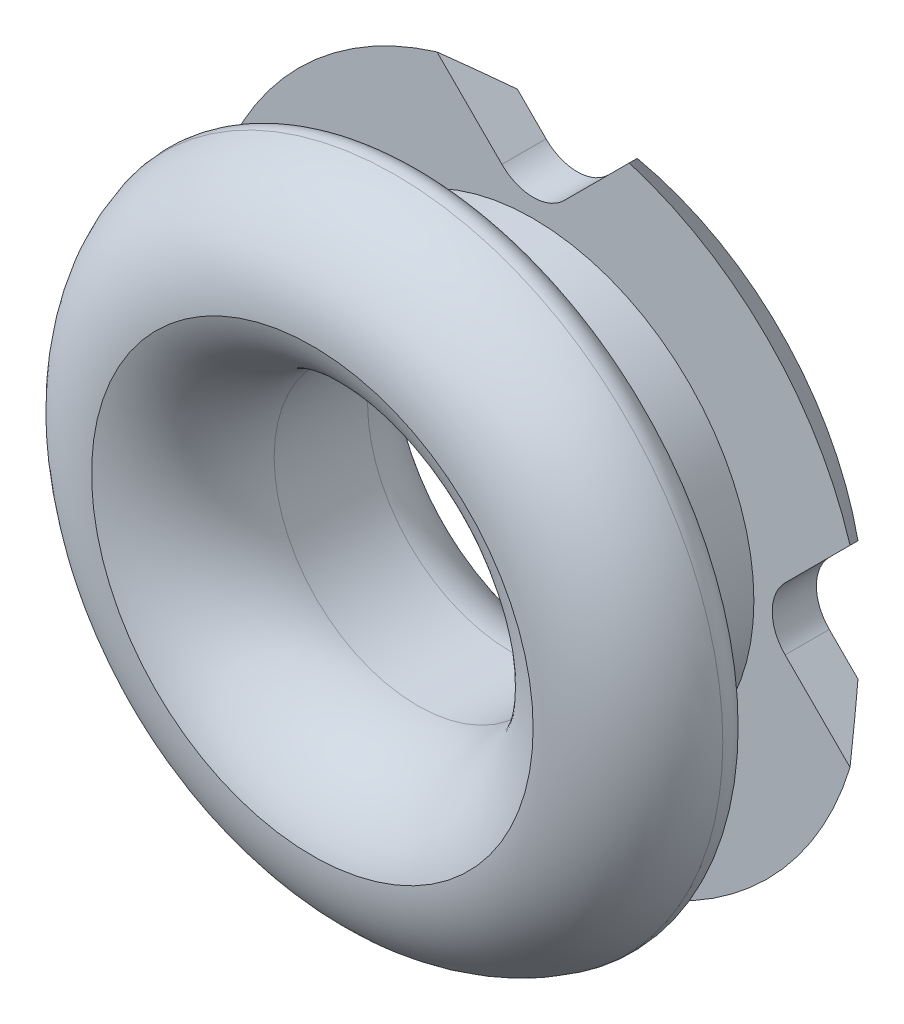
ISO-10303-21;
HEADER;
FILE_DESCRIPTION(('STEP AP214'),'2;1');
FILE_NAME('part.step','',(''),(''),'','','');
FILE_SCHEMA(('AUTOMOTIVE_DESIGN { 1 0 10303 214 1 1 1 1 }'));
ENDSEC;
DATA;
#1=APPLICATION_CONTEXT('core data for automotive mechanical design processes');
#2=APPLICATION_PROTOCOL_DEFINITION('international standard','automotive_design',2000,#1);
#3=PRODUCT_CONTEXT('',#1,'mechanical');
#4=PRODUCT('Part','Part','',(#3));
#5=PRODUCT_RELATED_PRODUCT_CATEGORY('part','',(#4));
#6=PRODUCT_DEFINITION_FORMATION('','',#4);
#7=PRODUCT_DEFINITION_CONTEXT('part definition',#1,'design');
#8=PRODUCT_DEFINITION('design','',#6,#7);
#9=PRODUCT_DEFINITION_SHAPE('','',#8);
#10=(LENGTH_UNIT() NAMED_UNIT(*) SI_UNIT(.MILLI.,.METRE.));
#11=(NAMED_UNIT(*) PLANE_ANGLE_UNIT() SI_UNIT($,.RADIAN.));
#12=(NAMED_UNIT(*) SI_UNIT($,.STERADIAN.) SOLID_ANGLE_UNIT());
#13=UNCERTAINTY_MEASURE_WITH_UNIT(LENGTH_MEASURE(1.E-05),#10,'distance_accuracy_value','');
#14=(GEOMETRIC_REPRESENTATION_CONTEXT(3) GLOBAL_UNCERTAINTY_ASSIGNED_CONTEXT((#13)) GLOBAL_UNIT_ASSIGNED_CONTEXT((#10,
#11,#12)) REPRESENTATION_CONTEXT('',''));
#15=CARTESIAN_POINT('',(0.,0.,0.));
#16=DIRECTION('',(0.,0.,1.));
#17=DIRECTION('',(1.,0.,0.));
#18=AXIS2_PLACEMENT_3D('',#15,#16,#17);
#19=CARTESIAN_POINT('',(0.,0.,0.5));
#20=DIRECTION('',(0.,0.,-1.));
#21=DIRECTION('',(-1.,0.,0.));
#22=AXIS2_PLACEMENT_3D('',#19,#20,#21);
#23=CYLINDRICAL_SURFACE('',#22,1.);
#24=CARTESIAN_POINT('',(0.,0.,0.5));
#25=DIRECTION('',(0.,0.,1.));
#26=DIRECTION('',(1.,0.,0.));
#27=AXIS2_PLACEMENT_3D('',#24,#25,#26);
#28=CIRCLE('',#27,1.);
#29=CARTESIAN_POINT('',(1.,0.,0.5));
#30=VERTEX_POINT('',#29);
#31=EDGE_CURVE('E174',#30,#30,#28,.T.);
#32=ORIENTED_EDGE('',*,*,#31,.F.);
#33=EDGE_LOOP('',(#32));
#34=FACE_BOUND('',#33,.T.);
#35=CARTESIAN_POINT('',(0.,0.,0.));
#36=DIRECTION('',(0.,0.,1.));
#37=DIRECTION('',(1.,0.,0.));
#38=AXIS2_PLACEMENT_3D('',#35,#36,#37);
#39=CIRCLE('',#38,1.);
#40=CARTESIAN_POINT('',(1.,0.,0.));
#41=VERTEX_POINT('',#40);
#42=CARTESIAN_POINT('',(0.,1.,0.));
#43=VERTEX_POINT('',#42);
#44=EDGE_CURVE('E167',#41,#43,#39,.T.);
#45=ORIENTED_EDGE('',*,*,#44,.T.);
#46=CARTESIAN_POINT('',(-1.,0.,0.));
#47=VERTEX_POINT('',#46);
#48=EDGE_CURVE('E163',#43,#47,#39,.T.);
#49=ORIENTED_EDGE('',*,*,#48,.T.);
#50=CARTESIAN_POINT('',(0.,-1.,0.));
#51=VERTEX_POINT('',#50);
#52=EDGE_CURVE('E170',#47,#51,#39,.T.);
#53=ORIENTED_EDGE('',*,*,#52,.T.);
#54=EDGE_CURVE('E173',#51,#41,#39,.T.);
#55=ORIENTED_EDGE('',*,*,#54,.T.);
#56=EDGE_LOOP('',(#45,#49,#53,#55));
#57=FACE_BOUND('',#56,.T.);
#58=ADVANCED_FACE('F32',(#34,#57),#23,.T.);
#59=CARTESIAN_POINT('',(0.,0.,0.5));
#60=DIRECTION('',(0.,0.,-1.));
#61=DIRECTION('',(-1.,0.,0.));
#62=AXIS2_PLACEMENT_3D('',#59,#60,#61);
#63=CYLINDRICAL_SURFACE('',#62,0.65);
#64=CARTESIAN_POINT('',(0.,0.,0.0999999999999999));
#65=DIRECTION('',(0.,0.,-1.));
#66=DIRECTION('',(-1.,0.,0.));
#67=AXIS2_PLACEMENT_3D('',#64,#65,#66);
#68=CIRCLE('',#67,0.65);
#69=CARTESIAN_POINT('',(-0.65,0.,0.0999999999999999));
#70=VERTEX_POINT('',#69);
#71=EDGE_CURVE('E40',#70,#70,#68,.T.);
#72=ORIENTED_EDGE('',*,*,#71,.T.);
#73=EDGE_LOOP('',(#72));
#74=FACE_BOUND('',#73,.T.);
#75=CARTESIAN_POINT('',(0.,0.,0.523030399291527));
#76=DIRECTION('',(0.,0.,1.));
#77=DIRECTION('',(1.,0.,0.));
#78=AXIS2_PLACEMENT_3D('',#75,#76,#77);
#79=CIRCLE('',#78,0.65);
#80=CARTESIAN_POINT('',(0.65,0.,0.523030399291527));
#81=VERTEX_POINT('',#80);
#82=EDGE_CURVE('E372',#81,#81,#79,.T.);
#83=ORIENTED_EDGE('',*,*,#82,.T.);
#84=EDGE_LOOP('',(#83));
#85=FACE_BOUND('',#84,.T.);
#86=ADVANCED_FACE('F349',(#74,#85),#63,.F.);
#87=CARTESIAN_POINT('',(0.,0.,0.5));
#88=DIRECTION('',(0.,0.,1.));
#89=DIRECTION('',(1.,0.,0.));
#90=AXIS2_PLACEMENT_3D('',#87,#88,#89);
#91=PLANE('',#90);
#92=CARTESIAN_POINT('',(0.,0.,0.5));
#93=DIRECTION('',(0.,0.,1.));
#94=DIRECTION('',(1.,0.,0.));
#95=AXIS2_PLACEMENT_3D('',#92,#93,#94);
#96=CIRCLE('',#95,1.38729833462074);
#97=CARTESIAN_POINT('',(1.38729833462074,0.,0.5));
#98=VERTEX_POINT('',#97);
#99=EDGE_CURVE('E377',#98,#98,#96,.F.);
#100=ORIENTED_EDGE('',*,*,#99,.T.);
#101=EDGE_LOOP('',(#100));
#102=FACE_BOUND('',#101,.T.);
#103=ORIENTED_EDGE('',*,*,#31,.T.);
#104=EDGE_LOOP('',(#103));
#105=FACE_BOUND('',#104,.T.);
#106=ADVANCED_FACE('F346',(#102,#105),#91,.F.);
#107=CARTESIAN_POINT('',(0.,0.,0.));
#108=DIRECTION('',(0.,0.,-1.));
#109=DIRECTION('',(-1.,0.,0.));
#110=AXIS2_PLACEMENT_3D('',#107,#108,#109);
#111=PLANE('',#110);
#112=ORIENTED_EDGE('',*,*,#52,.F.);
#113=ORIENTED_EDGE('',*,*,#48,.F.);
#114=ORIENTED_EDGE('',*,*,#44,.F.);
#115=ORIENTED_EDGE('',*,*,#54,.F.);
#116=EDGE_LOOP('',(#112,#113,#114,#115));
#117=FACE_BOUND('',#116,.T.);
#118=CARTESIAN_POINT('',(-1.28284271247462,0.,0.));
#119=DIRECTION('',(0.,0.,-1.));
#120=DIRECTION('',(-1.,0.,0.));
#121=AXIS2_PLACEMENT_3D('',#118,#119,#120);
#122=CIRCLE('',#121,0.2);
#123=CARTESIAN_POINT('',(-1.14142135623731,0.141421356237309,0.));
#124=VERTEX_POINT('',#123);
#125=CARTESIAN_POINT('',(-1.14142135623731,-0.141421356237309,0.));
#126=VERTEX_POINT('',#125);
#127=EDGE_CURVE('E253',#124,#126,#122,.T.);
#128=ORIENTED_EDGE('',*,*,#127,.T.);
#129=DIRECTION('',(0.707106781186546,0.707106781186549,0.));
#130=VECTOR('',#129,1.);
#131=CARTESIAN_POINT('',(-1.,0.,0.));
#132=LINE('',#131,#130);
#133=CARTESIAN_POINT('',(-1.43541434669349,-0.435414346693486,0.));
#134=VERTEX_POINT('',#133);
#135=EDGE_CURVE('E211',#134,#126,#132,.T.);
#136=ORIENTED_EDGE('',*,*,#135,.F.);
#137=CARTESIAN_POINT('',(0.,0.,0.));
#138=DIRECTION('',(0.,0.,-1.));
#139=DIRECTION('',(-1.,0.,0.));
#140=AXIS2_PLACEMENT_3D('',#137,#138,#139);
#141=CIRCLE('',#140,1.5);
#142=CARTESIAN_POINT('',(-0.435414346693492,-1.43541434669348,0.));
#143=VERTEX_POINT('',#142);
#144=EDGE_CURVE('E208',#143,#134,#141,.T.);
#145=ORIENTED_EDGE('',*,*,#144,.F.);
#146=DIRECTION('',(-0.707106781186554,-0.707106781186541,0.));
#147=VECTOR('',#146,1.);
#148=CARTESIAN_POINT('',(0.,-1.,0.));
#149=LINE('',#148,#147);
#150=CARTESIAN_POINT('',(-0.14142135623731,-1.14142135623731,0.));
#151=VERTEX_POINT('',#150);
#152=EDGE_CURVE('E206',#151,#143,#149,.T.);
#153=ORIENTED_EDGE('',*,*,#152,.F.);
#154=CARTESIAN_POINT('',(0.,-1.28284271247462,0.));
#155=DIRECTION('',(0.,0.,-1.));
#156=DIRECTION('',(-1.,0.,0.));
#157=AXIS2_PLACEMENT_3D('',#154,#155,#156);
#158=CIRCLE('',#157,0.2);
#159=CARTESIAN_POINT('',(0.141421356237308,-1.14142135623731,0.));
#160=VERTEX_POINT('',#159);
#161=EDGE_CURVE('E425',#151,#160,#158,.T.);
#162=ORIENTED_EDGE('',*,*,#161,.T.);
#163=DIRECTION('',(-0.707106781186544,0.707106781186551,0.));
#164=VECTOR('',#163,1.);
#165=CARTESIAN_POINT('',(0.,-1.,0.));
#166=LINE('',#165,#164);
#167=CARTESIAN_POINT('',(0.435414346693482,-1.43541434669349,0.));
#168=VERTEX_POINT('',#167);
#169=EDGE_CURVE('E204',#168,#160,#166,.T.);
#170=ORIENTED_EDGE('',*,*,#169,.F.);
#171=CARTESIAN_POINT('',(0.,0.,0.));
#172=DIRECTION('',(0.,0.,-1.));
#173=DIRECTION('',(-1.,0.,0.));
#174=AXIS2_PLACEMENT_3D('',#171,#172,#173);
#175=CIRCLE('',#174,1.5);
#176=CARTESIAN_POINT('',(1.43541434669348,-0.435414346693492,0.));
#177=VERTEX_POINT('',#176);
#178=EDGE_CURVE('E201',#177,#168,#175,.T.);
#179=ORIENTED_EDGE('',*,*,#178,.F.);
#180=DIRECTION('',(0.707106781186541,-0.707106781186554,0.));
#181=VECTOR('',#180,1.);
#182=CARTESIAN_POINT('',(1.,0.,0.));
#183=LINE('',#182,#181);
#184=CARTESIAN_POINT('',(1.14142135623731,-0.14142135623731,0.));
#185=VERTEX_POINT('',#184);
#186=EDGE_CURVE('E199',#185,#177,#183,.T.);
#187=ORIENTED_EDGE('',*,*,#186,.F.);
#188=CARTESIAN_POINT('',(1.28284271247462,0.,0.));
#189=DIRECTION('',(0.,0.,-1.));
#190=DIRECTION('',(-1.,0.,0.));
#191=AXIS2_PLACEMENT_3D('',#188,#189,#190);
#192=CIRCLE('',#191,0.2);
#193=CARTESIAN_POINT('',(1.14142135623731,0.141421356237308,0.));
#194=VERTEX_POINT('',#193);
#195=EDGE_CURVE('E420',#185,#194,#192,.T.);
#196=ORIENTED_EDGE('',*,*,#195,.T.);
#197=DIRECTION('',(-0.707106781186551,-0.707106781186544,0.));
#198=VECTOR('',#197,1.);
#199=CARTESIAN_POINT('',(1.,0.,0.));
#200=LINE('',#199,#198);
#201=CARTESIAN_POINT('',(1.43541434669349,0.435414346693482,0.));
#202=VERTEX_POINT('',#201);
#203=EDGE_CURVE('E197',#202,#194,#200,.T.);
#204=ORIENTED_EDGE('',*,*,#203,.F.);
#205=CARTESIAN_POINT('',(0.,0.,0.));
#206=DIRECTION('',(0.,0.,-1.));
#207=DIRECTION('',(-1.,0.,0.));
#208=AXIS2_PLACEMENT_3D('',#205,#206,#207);
#209=CIRCLE('',#208,1.5);
#210=CARTESIAN_POINT('',(0.435414346693487,1.43541434669348,0.));
#211=VERTEX_POINT('',#210);
#212=EDGE_CURVE('E194',#211,#202,#209,.T.);
#213=ORIENTED_EDGE('',*,*,#212,.F.);
#214=DIRECTION('',(0.707106781186549,0.707106781186546,0.));
#215=VECTOR('',#214,1.);
#216=CARTESIAN_POINT('',(0.,1.,0.));
#217=LINE('',#216,#215);
#218=CARTESIAN_POINT('',(0.141421356237309,1.14142135623731,0.));
#219=VERTEX_POINT('',#218);
#220=EDGE_CURVE('E192',#219,#211,#217,.T.);
#221=ORIENTED_EDGE('',*,*,#220,.F.);
#222=CARTESIAN_POINT('',(0.,1.28284271247462,0.));
#223=DIRECTION('',(0.,0.,-1.));
#224=DIRECTION('',(-1.,0.,0.));
#225=AXIS2_PLACEMENT_3D('',#222,#223,#224);
#226=CIRCLE('',#225,0.2);
#227=CARTESIAN_POINT('',(-0.141421356237309,1.14142135623731,0.));
#228=VERTEX_POINT('',#227);
#229=EDGE_CURVE('E416',#219,#228,#226,.T.);
#230=ORIENTED_EDGE('',*,*,#229,.T.);
#231=DIRECTION('',(0.707106781186549,-0.707106781186546,0.));
#232=VECTOR('',#231,1.);
#233=CARTESIAN_POINT('',(0.,1.,0.));
#234=LINE('',#233,#232);
#235=CARTESIAN_POINT('',(-0.435414346693486,1.43541434669348,0.));
#236=VERTEX_POINT('',#235);
#237=EDGE_CURVE('E190',#236,#228,#234,.T.);
#238=ORIENTED_EDGE('',*,*,#237,.F.);
#239=CARTESIAN_POINT('',(0.,0.,0.));
#240=DIRECTION('',(0.,0.,-1.));
#241=DIRECTION('',(-1.,0.,0.));
#242=AXIS2_PLACEMENT_3D('',#239,#240,#241);
#243=CIRCLE('',#242,1.5);
#244=CARTESIAN_POINT('',(-1.43541434669348,0.435414346693487,0.));
#245=VERTEX_POINT('',#244);
#246=EDGE_CURVE('E215',#245,#236,#243,.T.);
#247=ORIENTED_EDGE('',*,*,#246,.F.);
#248=DIRECTION('',(-0.707106781186546,0.707106781186549,0.));
#249=VECTOR('',#248,1.);
#250=CARTESIAN_POINT('',(-1.,0.,0.));
#251=LINE('',#250,#249);
#252=EDGE_CURVE('E213',#124,#245,#251,.T.);
#253=ORIENTED_EDGE('',*,*,#252,.F.);
#254=EDGE_LOOP('',(#128,#136,#145,#153,#162,#170,#179,#187,#196,#204,#213,#221,#230,#238,#247,#253));
#255=FACE_BOUND('',#254,.T.);
#256=ADVANCED_FACE('F165',(#117,#255),#111,.F.);
#257=CARTESIAN_POINT('',(0.,0.,-0.2));
#258=DIRECTION('',(0.,0.,-1.));
#259=DIRECTION('',(-1.,0.,0.));
#260=AXIS2_PLACEMENT_3D('',#257,#258,#259);
#261=PLANE('',#260);
#262=CARTESIAN_POINT('',(0.,0.,-0.2));
#263=DIRECTION('',(0.,0.,-1.));
#264=DIRECTION('',(-1.,0.,0.));
#265=AXIS2_PLACEMENT_3D('',#262,#263,#264);
#266=CIRCLE('',#265,0.95);
#267=CARTESIAN_POINT('',(-0.95,0.,-0.2));
#268=VERTEX_POINT('',#267);
#269=EDGE_CURVE('E11',#268,#268,#266,.F.);
#270=ORIENTED_EDGE('',*,*,#269,.T.);
#271=EDGE_LOOP('',(#270));
#272=FACE_BOUND('',#271,.T.);
#273=DIRECTION('',(-0.707106781186554,-0.707106781186541,0.));
#274=VECTOR('',#273,1.);
#275=CARTESIAN_POINT('',(0.,-1.,-0.2));
#276=LINE('',#275,#274);
#277=CARTESIAN_POINT('',(-0.14142135623731,-1.14142135623731,-0.2));
#278=VERTEX_POINT('',#277);
#279=CARTESIAN_POINT('',(-0.23621335308983,-1.23621335308983,-0.2));
#280=VERTEX_POINT('',#279);
#281=EDGE_CURVE('E186',#278,#280,#276,.T.);
#282=ORIENTED_EDGE('',*,*,#281,.T.);
#283=CARTESIAN_POINT('',(0.,0.,-0.2));
#284=DIRECTION('',(0.,0.,-1.));
#285=DIRECTION('',(-1.,0.,0.));
#286=AXIS2_PLACEMENT_3D('',#283,#284,#285);
#287=CIRCLE('',#286,1.25857864376269);
#288=CARTESIAN_POINT('',(-1.23621335308983,-0.236213353089828,-0.2));
#289=VERTEX_POINT('',#288);
#290=EDGE_CURVE('E240',#280,#289,#287,.T.);
#291=ORIENTED_EDGE('',*,*,#290,.T.);
#292=DIRECTION('',(0.707106781186546,0.707106781186549,0.));
#293=VECTOR('',#292,1.);
#294=CARTESIAN_POINT('',(-1.,0.,-0.2));
#295=LINE('',#294,#293);
#296=CARTESIAN_POINT('',(-1.14142135623731,-0.141421356237309,-0.2));
#297=VERTEX_POINT('',#296);
#298=EDGE_CURVE('E180',#289,#297,#295,.T.);
#299=ORIENTED_EDGE('',*,*,#298,.T.);
#300=CARTESIAN_POINT('',(-1.28284271247462,0.,-0.2));
#301=DIRECTION('',(0.,0.,-1.));
#302=DIRECTION('',(-1.,0.,0.));
#303=AXIS2_PLACEMENT_3D('',#300,#301,#302);
#304=CIRCLE('',#303,0.2);
#305=CARTESIAN_POINT('',(-1.14142135623731,0.141421356237309,-0.2));
#306=VERTEX_POINT('',#305);
#307=EDGE_CURVE('E250',#297,#306,#304,.F.);
#308=ORIENTED_EDGE('',*,*,#307,.T.);
#309=DIRECTION('',(-0.707106781186546,0.707106781186549,0.));
#310=VECTOR('',#309,1.);
#311=CARTESIAN_POINT('',(-1.,0.,-0.2));
#312=LINE('',#311,#310);
#313=CARTESIAN_POINT('',(-1.27136243102708,0.271362431027076,-0.2));
#314=VERTEX_POINT('',#313);
#315=EDGE_CURVE('E179',#306,#314,#312,.T.);
#316=ORIENTED_EDGE('',*,*,#315,.T.);
#317=CARTESIAN_POINT('',(0.,0.,-0.2));
#318=DIRECTION('',(0.,0.,-1.));
#319=DIRECTION('',(-1.,0.,0.));
#320=AXIS2_PLACEMENT_3D('',#317,#318,#319);
#321=CIRCLE('',#320,1.3);
#322=CARTESIAN_POINT('',(-0.271362431027076,1.27136243102708,-0.2));
#323=VERTEX_POINT('',#322);
#324=EDGE_CURVE('E285',#314,#323,#321,.T.);
#325=ORIENTED_EDGE('',*,*,#324,.T.);
#326=DIRECTION('',(0.707106781186549,-0.707106781186546,0.));
#327=VECTOR('',#326,1.);
#328=CARTESIAN_POINT('',(0.,1.,-0.2));
#329=LINE('',#328,#327);
#330=CARTESIAN_POINT('',(-0.141421356237309,1.14142135623731,-0.2));
#331=VERTEX_POINT('',#330);
#332=EDGE_CURVE('E217',#323,#331,#329,.T.);
#333=ORIENTED_EDGE('',*,*,#332,.T.);
#334=CARTESIAN_POINT('',(0.,1.28284271247462,-0.2));
#335=DIRECTION('',(0.,0.,-1.));
#336=DIRECTION('',(-1.,0.,0.));
#337=AXIS2_PLACEMENT_3D('',#334,#335,#336);
#338=CIRCLE('',#337,0.2);
#339=CARTESIAN_POINT('',(0.141421356237309,1.14142135623731,-0.2));
#340=VERTEX_POINT('',#339);
#341=EDGE_CURVE('E418',#331,#340,#338,.F.);
#342=ORIENTED_EDGE('',*,*,#341,.T.);
#343=DIRECTION('',(0.707106781186549,0.707106781186546,0.));
#344=VECTOR('',#343,1.);
#345=CARTESIAN_POINT('',(0.,1.,-0.2));
#346=LINE('',#345,#344);
#347=CARTESIAN_POINT('',(0.271362431027076,1.27136243102708,-0.2));
#348=VERTEX_POINT('',#347);
#349=EDGE_CURVE('E222',#340,#348,#346,.T.);
#350=ORIENTED_EDGE('',*,*,#349,.T.);
#351=CARTESIAN_POINT('',(0.,0.,-0.2));
#352=DIRECTION('',(0.,0.,-1.));
#353=DIRECTION('',(-1.,0.,0.));
#354=AXIS2_PLACEMENT_3D('',#351,#352,#353);
#355=CIRCLE('',#354,1.3);
#356=CARTESIAN_POINT('',(1.27136243102708,0.271362431027073,-0.2));
#357=VERTEX_POINT('',#356);
#358=EDGE_CURVE('E384',#348,#357,#355,.T.);
#359=ORIENTED_EDGE('',*,*,#358,.T.);
#360=DIRECTION('',(-0.707106781186551,-0.707106781186544,0.));
#361=VECTOR('',#360,1.);
#362=CARTESIAN_POINT('',(1.,0.,-0.2));
#363=LINE('',#362,#361);
#364=CARTESIAN_POINT('',(1.14142135623731,0.141421356237308,-0.2));
#365=VERTEX_POINT('',#364);
#366=EDGE_CURVE('E226',#357,#365,#363,.T.);
#367=ORIENTED_EDGE('',*,*,#366,.T.);
#368=CARTESIAN_POINT('',(1.28284271247462,0.,-0.2));
#369=DIRECTION('',(0.,0.,-1.));
#370=DIRECTION('',(-1.,0.,0.));
#371=AXIS2_PLACEMENT_3D('',#368,#369,#370);
#372=CIRCLE('',#371,0.2);
#373=CARTESIAN_POINT('',(1.14142135623731,-0.14142135623731,-0.2));
#374=VERTEX_POINT('',#373);
#375=EDGE_CURVE('E423',#365,#374,#372,.F.);
#376=ORIENTED_EDGE('',*,*,#375,.T.);
#377=DIRECTION('',(0.707106781186541,-0.707106781186554,0.));
#378=VECTOR('',#377,1.);
#379=CARTESIAN_POINT('',(1.,0.,-0.2));
#380=LINE('',#379,#378);
#381=CARTESIAN_POINT('',(1.27136243102707,-0.27136243102708,-0.2));
#382=VERTEX_POINT('',#381);
#383=EDGE_CURVE('E231',#374,#382,#380,.T.);
#384=ORIENTED_EDGE('',*,*,#383,.T.);
#385=CARTESIAN_POINT('',(0.,0.,-0.2));
#386=DIRECTION('',(0.,0.,-1.));
#387=DIRECTION('',(-1.,0.,0.));
#388=AXIS2_PLACEMENT_3D('',#385,#386,#387);
#389=CIRCLE('',#388,1.3);
#390=CARTESIAN_POINT('',(0.271362431027073,-1.27136243102708,-0.2));
#391=VERTEX_POINT('',#390);
#392=EDGE_CURVE('E382',#382,#391,#389,.T.);
#393=ORIENTED_EDGE('',*,*,#392,.T.);
#394=DIRECTION('',(-0.707106781186544,0.707106781186551,0.));
#395=VECTOR('',#394,1.);
#396=CARTESIAN_POINT('',(0.,-1.,-0.2));
#397=LINE('',#396,#395);
#398=CARTESIAN_POINT('',(0.141421356237308,-1.14142135623731,-0.2));
#399=VERTEX_POINT('',#398);
#400=EDGE_CURVE('E233',#391,#399,#397,.T.);
#401=ORIENTED_EDGE('',*,*,#400,.T.);
#402=CARTESIAN_POINT('',(0.,-1.28284271247462,-0.2));
#403=DIRECTION('',(0.,0.,-1.));
#404=DIRECTION('',(-1.,0.,0.));
#405=AXIS2_PLACEMENT_3D('',#402,#403,#404);
#406=CIRCLE('',#405,0.2);
#407=EDGE_CURVE('E242',#399,#278,#406,.F.);
#408=ORIENTED_EDGE('',*,*,#407,.T.);
#409=EDGE_LOOP('',(#282,#291,#299,#308,#316,#325,#333,#342,#350,#359,#367,#376,#384,#393,#401,#408));
#410=FACE_BOUND('',#409,.T.);
#411=ADVANCED_FACE('F239',(#272,#410),#261,.T.);
#412=CARTESIAN_POINT('',(0.,1.,-0.2));
#413=DIRECTION('',(-0.707106781186546,-0.707106781186549,0.));
#414=DIRECTION('',(0.707106781186549,-0.707106781186546,0.));
#415=AXIS2_PLACEMENT_3D('',#412,#413,#414);
#416=PLANE('',#415);
#417=ORIENTED_EDGE('',*,*,#237,.T.);
#418=DIRECTION('',(0.,0.,1.));
#419=VECTOR('',#418,1.);
#420=CARTESIAN_POINT('',(-0.141421356237309,1.14142135623731,-0.2));
#421=LINE('',#420,#419);
#422=EDGE_CURVE('E391',#228,#331,#421,.F.);
#423=ORIENTED_EDGE('',*,*,#422,.T.);
#424=ORIENTED_EDGE('',*,*,#332,.F.);
#425=CARTESIAN_POINT('',(-0.271362431027076,1.27136243102708,-0.2));
#426=CARTESIAN_POINT('',(-0.28518935763174,1.28518935763174,-0.183590576904373));
#427=CARTESIAN_POINT('',(-0.298971344360146,1.29897134436015,-0.167105673335265));
#428=CARTESIAN_POINT('',(-0.326454206910643,1.32645420691064,-0.134002619856901));
#429=CARTESIAN_POINT('',(-0.340155085745735,1.34015508574573,-0.117384474951987));
#430=CARTESIAN_POINT('',(-0.367485429682946,1.36748542968294,-0.0840315509879362));
#431=CARTESIAN_POINT('',(-0.381114895328296,1.38111489532829,-0.067296772818277));
#432=CARTESIAN_POINT('',(-0.408310438899732,1.40831043889973,-0.0337230524877311));
#433=CARTESIAN_POINT('',(-0.421876514439273,1.42187651443927,-0.0168841064596627));
#434=CARTESIAN_POINT('',(-0.435414346693488,1.43541434669349,0.));
#435=B_SPLINE_CURVE_WITH_KNOTS('',3,(#425,#426,#427,#428,#429,#430,#431,#432,#433,#434),
.UNSPECIFIED.,.F.,.F.,(4,2,2,2,4),(0.,0.0765811171151188,0.153159371308492,0.229737042131764,
0.3063175731324),.UNSPECIFIED.);
#436=EDGE_CURVE('E307',#323,#236,#435,.T.);
#437=ORIENTED_EDGE('',*,*,#436,.T.);
#438=EDGE_LOOP('',(#417,#423,#424,#437));
#439=FACE_BOUND('',#438,.T.);
#440=ADVANCED_FACE('F340',(#439),#416,.F.);
#441=CARTESIAN_POINT('',(0.,1.,-0.2));
#442=DIRECTION('',(0.707106781186546,-0.707106781186549,0.));
#443=DIRECTION('',(0.707106781186549,0.707106781186546,0.));
#444=AXIS2_PLACEMENT_3D('',#441,#442,#443);
#445=PLANE('',#444);
#446=ORIENTED_EDGE('',*,*,#349,.F.);
#447=DIRECTION('',(0.,0.,1.));
#448=VECTOR('',#447,1.);
#449=CARTESIAN_POINT('',(0.141421356237309,1.14142135623731,0.));
#450=LINE('',#449,#448);
#451=EDGE_CURVE('E395',#340,#219,#450,.T.);
#452=ORIENTED_EDGE('',*,*,#451,.T.);
#453=ORIENTED_EDGE('',*,*,#220,.T.);
#454=CARTESIAN_POINT('',(0.435414346693487,1.43541434669348,0.));
#455=CARTESIAN_POINT('',(0.421876514439273,1.42187651443927,-0.0168841064596609));
#456=CARTESIAN_POINT('',(0.408310438899732,1.40831043889973,-0.0337230524877301));
#457=CARTESIAN_POINT('',(0.381114895328296,1.38111489532829,-0.0672967728182769));
#458=CARTESIAN_POINT('',(0.367485429682946,1.36748542968294,-0.084031550987936));
#459=CARTESIAN_POINT('',(0.340155085745736,1.34015508574573,-0.117384474951987));
#460=CARTESIAN_POINT('',(0.326454206910643,1.32645420691064,-0.1340026198569));
#461=CARTESIAN_POINT('',(0.298971344360147,1.29897134436015,-0.167105673335266));
#462=CARTESIAN_POINT('',(0.285189357631741,1.28518935763174,-0.183590576904375));
#463=CARTESIAN_POINT('',(0.27136243102708,1.27136243102708,-0.200000000000006));
#464=B_SPLINE_CURVE_WITH_KNOTS('',3,(#454,#455,#456,#457,#458,#459,#460,#461,#462,#463),
.UNSPECIFIED.,.F.,.F.,(4,2,2,2,4),(0.,0.0765805310006362,0.153158201823909,0.229736456017282,
0.306317573132401),.UNSPECIFIED.);
#465=EDGE_CURVE('E324',#211,#348,#464,.T.);
#466=ORIENTED_EDGE('',*,*,#465,.T.);
#467=EDGE_LOOP('',(#446,#452,#453,#466));
#468=FACE_BOUND('',#467,.T.);
#469=ADVANCED_FACE('F335',(#468),#445,.F.);
#470=CARTESIAN_POINT('',(1.,0.,-0.2));
#471=DIRECTION('',(-0.707106781186544,0.707106781186551,0.));
#472=DIRECTION('',(-0.707106781186551,-0.707106781186544,0.));
#473=AXIS2_PLACEMENT_3D('',#470,#471,#472);
#474=PLANE('',#473);
#475=ORIENTED_EDGE('',*,*,#203,.T.);
#476=DIRECTION('',(0.,0.,1.));
#477=VECTOR('',#476,1.);
#478=CARTESIAN_POINT('',(1.14142135623731,0.141421356237308,-0.2));
#479=LINE('',#478,#477);
#480=EDGE_CURVE('E398',#194,#365,#479,.F.);
#481=ORIENTED_EDGE('',*,*,#480,.T.);
#482=ORIENTED_EDGE('',*,*,#366,.F.);
#483=CARTESIAN_POINT('',(1.27136243102708,0.271362431027073,-0.2));
#484=CARTESIAN_POINT('',(1.28518935763174,0.285189357631736,-0.183590576904373));
#485=CARTESIAN_POINT('',(1.29897134436015,0.298971344360143,-0.167105673335265));
#486=CARTESIAN_POINT('',(1.32645420691064,0.326454206910639,-0.1340026198569));
#487=CARTESIAN_POINT('',(1.34015508574574,0.340155085745732,-0.117384474951987));
#488=CARTESIAN_POINT('',(1.36748542968295,0.367485429682942,-0.0840315509879357));
#489=CARTESIAN_POINT('',(1.3811148953283,0.381114895328291,-0.0672967728182765));
#490=CARTESIAN_POINT('',(1.40831043889973,0.408310438899728,-0.0337230524877304));
#491=CARTESIAN_POINT('',(1.42187651443927,0.421876514439269,-0.016884106459662));
#492=CARTESIAN_POINT('',(1.43541434669349,0.435414346693483,0.));
#493=B_SPLINE_CURVE_WITH_KNOTS('',3,(#483,#484,#485,#486,#487,#488,#489,#490,#491,#492),
.UNSPECIFIED.,.F.,.F.,(4,2,2,2,4),(0.,0.076581117115119,0.153159371308492,0.229737042131765,
0.306317573132401),.UNSPECIFIED.);
#494=EDGE_CURVE('E318',#357,#202,#493,.T.);
#495=ORIENTED_EDGE('',*,*,#494,.T.);
#496=EDGE_LOOP('',(#475,#481,#482,#495));
#497=FACE_BOUND('',#496,.T.);
#498=ADVANCED_FACE('F330',(#497),#474,.F.);
#499=CARTESIAN_POINT('',(1.,0.,-0.2));
#500=DIRECTION('',(-0.707106781186554,-0.707106781186541,0.));
#501=DIRECTION('',(0.707106781186541,-0.707106781186554,0.));
#502=AXIS2_PLACEMENT_3D('',#499,#500,#501);
#503=PLANE('',#502);
#504=ORIENTED_EDGE('',*,*,#383,.F.);
#505=DIRECTION('',(0.,0.,1.));
#506=VECTOR('',#505,1.);
#507=CARTESIAN_POINT('',(1.14142135623731,-0.14142135623731,0.));
#508=LINE('',#507,#506);
#509=EDGE_CURVE('E394',#374,#185,#508,.T.);
#510=ORIENTED_EDGE('',*,*,#509,.T.);
#511=ORIENTED_EDGE('',*,*,#186,.T.);
#512=CARTESIAN_POINT('',(1.43541434669348,-0.435414346693492,0.));
#513=CARTESIAN_POINT('',(1.42187651443927,-0.421876514439277,-0.0168841064596612));
#514=CARTESIAN_POINT('',(1.40831043889973,-0.408310438899737,-0.0337230524877303));
#515=CARTESIAN_POINT('',(1.38111489532829,-0.3811148953283,-0.067296772818277));
#516=CARTESIAN_POINT('',(1.36748542968294,-0.367485429682951,-0.0840315509879361));
#517=CARTESIAN_POINT('',(1.34015508574573,-0.34015508574574,-0.117384474951987));
#518=CARTESIAN_POINT('',(1.32645420691064,-0.326454206910647,-0.1340026198569));
#519=CARTESIAN_POINT('',(1.29897134436014,-0.29897134436015,-0.167105673335266));
#520=CARTESIAN_POINT('',(1.28518935763174,-0.285189357631745,-0.183590576904375));
#521=CARTESIAN_POINT('',(1.27136243102708,-0.271362431027083,-0.200000000000006));
#522=B_SPLINE_CURVE_WITH_KNOTS('',3,(#512,#513,#514,#515,#516,#517,#518,#519,#520,#521),
.UNSPECIFIED.,.F.,.F.,(4,2,2,2,4),(0.,0.0765805310006361,0.153158201823909,0.229736456017282,
0.306317573132401),.UNSPECIFIED.);
#523=EDGE_CURVE('E401',#177,#382,#522,.T.);
#524=ORIENTED_EDGE('',*,*,#523,.T.);
#525=EDGE_LOOP('',(#504,#510,#511,#524));
#526=FACE_BOUND('',#525,.T.);
#527=ADVANCED_FACE('F334',(#526),#503,.F.);
#528=CARTESIAN_POINT('',(0.,-1.,-0.2));
#529=DIRECTION('',(0.707106781186551,0.707106781186544,0.));
#530=DIRECTION('',(-0.707106781186544,0.707106781186551,0.));
#531=AXIS2_PLACEMENT_3D('',#528,#529,#530);
#532=PLANE('',#531);
#533=ORIENTED_EDGE('',*,*,#169,.T.);
#534=DIRECTION('',(0.,0.,1.));
#535=VECTOR('',#534,1.);
#536=CARTESIAN_POINT('',(0.141421356237308,-1.14142135623731,-0.2));
#537=LINE('',#536,#535);
#538=EDGE_CURVE('E408',#160,#399,#537,.F.);
#539=ORIENTED_EDGE('',*,*,#538,.T.);
#540=ORIENTED_EDGE('',*,*,#400,.F.);
#541=CARTESIAN_POINT('',(0.271362431027073,-1.27136243102708,-0.2));
#542=CARTESIAN_POINT('',(0.285189357631736,-1.28518935763174,-0.183590576904373));
#543=CARTESIAN_POINT('',(0.298971344360143,-1.29897134436015,-0.167105673335265));
#544=CARTESIAN_POINT('',(0.326454206910639,-1.32645420691064,-0.134002619856901));
#545=CARTESIAN_POINT('',(0.340155085745732,-1.34015508574574,-0.117384474951987));
#546=CARTESIAN_POINT('',(0.367485429682942,-1.36748542968295,-0.0840315509879357));
#547=CARTESIAN_POINT('',(0.381114895328291,-1.3811148953283,-0.0672967728182765));
#548=CARTESIAN_POINT('',(0.408310438899728,-1.40831043889973,-0.0337230524877304));
#549=CARTESIAN_POINT('',(0.421876514439269,-1.42187651443927,-0.0168841064596621));
#550=CARTESIAN_POINT('',(0.435414346693483,-1.43541434669349,0.));
#551=B_SPLINE_CURVE_WITH_KNOTS('',3,(#541,#542,#543,#544,#545,#546,#547,#548,#549,#550),
.UNSPECIFIED.,.F.,.F.,(4,2,2,2,4),(0.,0.0765811171151189,0.153159371308492,0.229737042131765,
0.3063175731324),.UNSPECIFIED.);
#552=EDGE_CURVE('E623',#391,#168,#551,.T.);
#553=ORIENTED_EDGE('',*,*,#552,.T.);
#554=EDGE_LOOP('',(#533,#539,#540,#553));
#555=FACE_BOUND('',#554,.T.);
#556=ADVANCED_FACE('F584',(#555),#532,.F.);
#557=CARTESIAN_POINT('',(0.,-1.,-0.2));
#558=DIRECTION('',(-0.707106781186541,0.707106781186554,0.));
#559=DIRECTION('',(-0.707106781186554,-0.707106781186541,0.));
#560=AXIS2_PLACEMENT_3D('',#557,#558,#559);
#561=PLANE('',#560);
#562=CARTESIAN_POINT('',(-0.435414346693492,-1.43541434669348,0.));
#563=CARTESIAN_POINT('',(-0.421876514439278,-1.42187651443927,-0.0168841064596607));
#564=CARTESIAN_POINT('',(-0.408310438899737,-1.40831043889973,-0.0337230524877299));
#565=CARTESIAN_POINT('',(-0.3811148953283,-1.38111489532829,-0.0672967728182767));
#566=CARTESIAN_POINT('',(-0.36748542968295,-1.36748542968294,-0.0840315509879358));
#567=CARTESIAN_POINT('',(-0.340155085745739,-1.34015508574573,-0.117384474951987));
#568=CARTESIAN_POINT('',(-0.326454206910646,-1.32645420691064,-0.1340026198569));
#569=CARTESIAN_POINT('',(-0.29897134436015,-1.29897134436014,-0.167105673335266));
#570=CARTESIAN_POINT('',(-0.285189357631744,-1.28518935763174,-0.183590576904375));
#571=CARTESIAN_POINT('',(-0.271362431027083,-1.27136243102708,-0.200000000000006));
#572=B_SPLINE_CURVE_WITH_KNOTS('',3,(#562,#563,#564,#565,#566,#567,#568,#569,#570,#571),
.UNSPECIFIED.,.F.,.F.,(4,2,2,2,4),(0.,0.0765805310006363,0.153158201823909,0.229736456017282,
0.306317573132401),.UNSPECIFIED.);
#573=CARTESIAN_POINT('',(-0.295930305137503,-1.2959303051375,-0.170710678116857));
#574=VERTEX_POINT('',#573);
#575=EDGE_CURVE('E284',#143,#574,#572,.T.);
#576=ORIENTED_EDGE('',*,*,#575,.T.);
#577=CARTESIAN_POINT('',(-0.295930305142733,-1.29593030513446,-0.170710678118655));
#578=CARTESIAN_POINT('',(-0.292209717648756,-1.29220971764579,-0.175167189773653));
#579=CARTESIAN_POINT('',(-0.288203233436859,-1.28820323343606,-0.179114342715605));
#580=CARTESIAN_POINT('',(-0.279785205764393,-1.27978520576518,-0.185975634077075));
#581=CARTESIAN_POINT('',(-0.275375029413919,-1.27537502941413,-0.188893107606284));
#582=CARTESIAN_POINT('',(-0.266305110108345,-1.26630511010813,-0.193701913423758));
#583=CARTESIAN_POINT('',(-0.261646244634351,-1.26164624463429,-0.195596621459887));
#584=CARTESIAN_POINT('',(-0.252184762531227,-1.25218476253128,-0.198396025846688));
#585=CARTESIAN_POINT('',(-0.247382224535579,-1.24738222453559,-0.199301253922446));
#586=CARTESIAN_POINT('',(-0.24044750824439,-1.24044750824438,-0.199908066886766));
#587=CARTESIAN_POINT('',(-0.238329832992355,-1.23832983299234,-0.200000078240167));
#588=CARTESIAN_POINT('',(-0.236213353089831,-1.23621335308983,-0.2));
#589=B_SPLINE_CURVE_WITH_KNOTS('',3,(#577,#578,#579,#580,#581,#582,#583,#584,#585,#586,#587,
#588),.UNSPECIFIED.,.F.,.F.,(4,2,2,2,2,4),(0.,0.0206265191305221,0.0411856026764329,
0.061676407264965,0.0821561951175695,0.0911384248852818),.UNSPECIFIED.);
#590=EDGE_CURVE('E249',#574,#280,#589,.T.);
#591=ORIENTED_EDGE('',*,*,#590,.T.);
#592=ORIENTED_EDGE('',*,*,#281,.F.);
#593=DIRECTION('',(0.,0.,1.));
#594=VECTOR('',#593,1.);
#595=CARTESIAN_POINT('',(-0.14142135623731,-1.14142135623731,0.));
#596=LINE('',#595,#594);
#597=EDGE_CURVE('E406',#278,#151,#596,.T.);
#598=ORIENTED_EDGE('',*,*,#597,.T.);
#599=ORIENTED_EDGE('',*,*,#152,.T.);
#600=EDGE_LOOP('',(#576,#591,#592,#598,#599));
#601=FACE_BOUND('',#600,.T.);
#602=ADVANCED_FACE('F270',(#601),#561,.F.);
#603=CARTESIAN_POINT('',(-1.,0.,-0.2));
#604=DIRECTION('',(0.707106781186549,-0.707106781186546,0.));
#605=DIRECTION('',(0.707106781186546,0.707106781186549,0.));
#606=AXIS2_PLACEMENT_3D('',#603,#604,#605);
#607=PLANE('',#606);
#608=ORIENTED_EDGE('',*,*,#298,.F.);
#609=CARTESIAN_POINT('',(-1.23621335308983,-0.236213353089828,-0.2));
#610=CARTESIAN_POINT('',(-1.24232920258599,-0.242329202585988,-0.200001125149917));
#611=CARTESIAN_POINT('',(-1.24845983195617,-0.24845983195617,-0.199231116232308));
#612=CARTESIAN_POINT('',(-1.26031348672929,-0.260313486729287,-0.196160866656706));
#613=CARTESIAN_POINT('',(-1.26604328711921,-0.266043287119214,-0.193912202198588));
#614=CARTESIAN_POINT('',(-1.27592333319113,-0.275923333191133,-0.1885370898184));
#615=CARTESIAN_POINT('',(-1.28015101990305,-0.280151019903054,-0.185697589893056));
#616=CARTESIAN_POINT('',(-1.28832829808359,-0.288328298083588,-0.178990670438314));
#617=CARTESIAN_POINT('',(-1.29226731599654,-0.292267315996538,-0.175097596446353));
#618=CARTESIAN_POINT('',(-1.295930305136,-0.295930305135997,-0.170710678118657));
#619=B_SPLINE_CURVE_WITH_KNOTS('',3,(#609,#610,#611,#612,#613,#614,#615,#616,#617,#618),
.UNSPECIFIED.,.F.,.F.,(4,2,2,2,4),(0.,0.0259470301359934,0.051033869661976,0.0708051227052168,
0.091109535673685),.UNSPECIFIED.);
#620=CARTESIAN_POINT('',(-1.295930305136,-0.295930305135997,-0.170710678118657));
#621=VERTEX_POINT('',#620);
#622=EDGE_CURVE('E55',#289,#621,#619,.T.);
#623=ORIENTED_EDGE('',*,*,#622,.T.);
#624=CARTESIAN_POINT('',(-1.27136243102708,-0.271362431027076,-0.2));
#625=CARTESIAN_POINT('',(-1.28518935763174,-0.285189357631739,-0.183590576904373));
#626=CARTESIAN_POINT('',(-1.29897134436015,-0.298971344360146,-0.167105673335265));
#627=CARTESIAN_POINT('',(-1.32645420691064,-0.326454206910643,-0.1340026198569));
#628=CARTESIAN_POINT('',(-1.34015508574573,-0.340155085745735,-0.117384474951987));
#629=CARTESIAN_POINT('',(-1.36748542968294,-0.367485429682946,-0.0840315509879356));
#630=CARTESIAN_POINT('',(-1.38111489532829,-0.381114895328295,-0.0672967728182764));
#631=CARTESIAN_POINT('',(-1.40831043889973,-0.408310438899732,-0.0337230524877303));
#632=CARTESIAN_POINT('',(-1.42187651443927,-0.421876514439273,-0.0168841064596619));
#633=CARTESIAN_POINT('',(-1.43541434669349,-0.435414346693488,0.));
#634=B_SPLINE_CURVE_WITH_KNOTS('',3,(#624,#625,#626,#627,#628,#629,#630,#631,#632,#633),
.UNSPECIFIED.,.F.,.F.,(4,2,2,2,4),(0.,0.0765811171151191,0.153159371308492,0.229737042131765,
0.306317573132401),.UNSPECIFIED.);
#635=EDGE_CURVE('E277',#621,#134,#634,.T.);
#636=ORIENTED_EDGE('',*,*,#635,.T.);
#637=ORIENTED_EDGE('',*,*,#135,.T.);
#638=DIRECTION('',(0.,0.,1.));
#639=VECTOR('',#638,1.);
#640=CARTESIAN_POINT('',(-1.14142135623731,-0.141421356237309,-0.2));
#641=LINE('',#640,#639);
#642=EDGE_CURVE('E413',#126,#297,#641,.F.);
#643=ORIENTED_EDGE('',*,*,#642,.T.);
#644=EDGE_LOOP('',(#608,#623,#636,#637,#643));
#645=FACE_BOUND('',#644,.T.);
#646=ADVANCED_FACE('F264',(#645),#607,.F.);
#647=CARTESIAN_POINT('',(-1.,0.,-0.2));
#648=DIRECTION('',(0.707106781186549,0.707106781186546,0.));
#649=DIRECTION('',(-0.707106781186546,0.707106781186549,0.));
#650=AXIS2_PLACEMENT_3D('',#647,#648,#649);
#651=PLANE('',#650);
#652=ORIENTED_EDGE('',*,*,#315,.F.);
#653=DIRECTION('',(0.,0.,1.));
#654=VECTOR('',#653,1.);
#655=CARTESIAN_POINT('',(-1.14142135623731,0.141421356237309,0.));
#656=LINE('',#655,#654);
#657=EDGE_CURVE('E410',#306,#124,#656,.T.);
#658=ORIENTED_EDGE('',*,*,#657,.T.);
#659=ORIENTED_EDGE('',*,*,#252,.T.);
#660=CARTESIAN_POINT('',(-1.43541434669348,0.435414346693487,0.));
#661=CARTESIAN_POINT('',(-1.42187651443927,0.421876514439273,-0.0168841064596615));
#662=CARTESIAN_POINT('',(-1.40831043889973,0.408310438899732,-0.0337230524877306));
#663=CARTESIAN_POINT('',(-1.38111489532829,0.381114895328296,-0.0672967728182772));
#664=CARTESIAN_POINT('',(-1.36748542968294,0.367485429682946,-0.0840315509879363));
#665=CARTESIAN_POINT('',(-1.34015508574573,0.340155085745736,-0.117384474951987));
#666=CARTESIAN_POINT('',(-1.32645420691064,0.326454206910643,-0.1340026198569));
#667=CARTESIAN_POINT('',(-1.29897134436015,0.298971344360147,-0.167105673335266));
#668=CARTESIAN_POINT('',(-1.28518935763174,0.285189357631741,-0.183590576904375));
#669=CARTESIAN_POINT('',(-1.27136243102708,0.27136243102708,-0.200000000000006));
#670=B_SPLINE_CURVE_WITH_KNOTS('',3,(#660,#661,#662,#663,#664,#665,#666,#667,#668,#669),
.UNSPECIFIED.,.F.,.F.,(4,2,2,2,4),(0.,0.0765805310006359,0.153158201823908,0.229736456017281,
0.3063175731324),.UNSPECIFIED.);
#671=EDGE_CURVE('E313',#245,#314,#670,.T.);
#672=ORIENTED_EDGE('',*,*,#671,.T.);
#673=EDGE_LOOP('',(#652,#658,#659,#672));
#674=FACE_BOUND('',#673,.T.);
#675=ADVANCED_FACE('F269',(#674),#651,.F.);
#676=CARTESIAN_POINT('',(0.,0.,0.5));
#677=DIRECTION('',(0.,0.,1.));
#678=DIRECTION('',(1.,0.,0.));
#679=AXIS2_PLACEMENT_3D('',#676,#677,#678);
#680=TOROIDAL_SURFACE('',#679,1.,0.5);
#681=CARTESIAN_POINT('',(0.,0.,0.625));
#682=DIRECTION('',(0.,0.,-1.));
#683=DIRECTION('',(-1.,0.,0.));
#684=AXIS2_PLACEMENT_3D('',#681,#682,#683);
#685=CIRCLE('',#684,1.48412291827593);
#686=CARTESIAN_POINT('',(-1.48412291827593,0.,0.625));
#687=VERTEX_POINT('',#686);
#688=EDGE_CURVE('E374',#687,#687,#685,.F.);
#689=ORIENTED_EDGE('',*,*,#688,.T.);
#690=EDGE_LOOP('',(#689));
#691=FACE_BOUND('',#690,.T.);
#692=CARTESIAN_POINT('',(0.,0.,1.));
#693=DIRECTION('',(0.,0.,1.));
#694=DIRECTION('',(1.,0.,0.));
#695=AXIS2_PLACEMENT_3D('',#692,#693,#694);
#696=CIRCLE('',#695,1.);
#697=CARTESIAN_POINT('',(1.,0.,1.));
#698=VERTEX_POINT('',#697);
#699=EDGE_CURVE('E176',#698,#698,#696,.T.);
#700=ORIENTED_EDGE('',*,*,#699,.F.);
#701=EDGE_LOOP('',(#700));
#702=FACE_BOUND('',#701,.T.);
#703=ADVANCED_FACE('F357',(#691,#702),#680,.T.);
#704=CARTESIAN_POINT('',(0.,0.,0.523030399291527));
#705=DIRECTION('',(0.,0.,1.));
#706=DIRECTION('',(1.,0.,0.));
#707=AXIS2_PLACEMENT_3D('',#704,#705,#706);
#708=TOROIDAL_SURFACE('',#707,1.15,0.5);
#709=ORIENTED_EDGE('',*,*,#699,.T.);
#710=EDGE_LOOP('',(#709));
#711=FACE_BOUND('',#710,.T.);
#712=ORIENTED_EDGE('',*,*,#82,.F.);
#713=EDGE_LOOP('',(#712));
#714=FACE_BOUND('',#713,.T.);
#715=ADVANCED_FACE('F359',(#711,#714),#708,.T.);
#716=CARTESIAN_POINT('',(0.,0.,0.6));
#717=DIRECTION('',(0.,0.,1.));
#718=DIRECTION('',(1.,0.,0.));
#719=AXIS2_PLACEMENT_3D('',#716,#717,#718);
#720=TOROIDAL_SURFACE('',#719,1.38729833462074,0.1);
#721=ORIENTED_EDGE('',*,*,#99,.F.);
#722=EDGE_LOOP('',(#721));
#723=FACE_BOUND('',#722,.T.);
#724=ORIENTED_EDGE('',*,*,#688,.F.);
#725=EDGE_LOOP('',(#724));
#726=FACE_BOUND('',#725,.T.);
#727=ADVANCED_FACE('F297',(#723,#726),#720,.T.);
#728=CARTESIAN_POINT('',(0.,0.,-0.2));
#729=DIRECTION('',(0.,0.,1.));
#730=DIRECTION('',(1.,0.,0.));
#731=AXIS2_PLACEMENT_3D('',#728,#729,#730);
#732=CONICAL_SURFACE('',#731,1.3,0.785398163397447);
#733=ORIENTED_EDGE('',*,*,#635,.F.);
#734=CARTESIAN_POINT('',(0.,0.,-0.170710678118655));
#735=DIRECTION('',(0.,0.,-1.));
#736=DIRECTION('',(-1.,0.,0.));
#737=AXIS2_PLACEMENT_3D('',#734,#735,#736);
#738=CIRCLE('',#737,1.32928932188135);
#739=EDGE_CURVE('E47',#621,#574,#738,.F.);
#740=ORIENTED_EDGE('',*,*,#739,.T.);
#741=ORIENTED_EDGE('',*,*,#575,.F.);
#742=ORIENTED_EDGE('',*,*,#144,.T.);
#743=EDGE_LOOP('',(#733,#740,#741,#742));
#744=FACE_BOUND('',#743,.T.);
#745=ADVANCED_FACE('F291',(#744),#732,.T.);
#746=CARTESIAN_POINT('',(0.,0.,-0.2));
#747=DIRECTION('',(0.,0.,1.));
#748=DIRECTION('',(1.,0.,0.));
#749=AXIS2_PLACEMENT_3D('',#746,#747,#748);
#750=CONICAL_SURFACE('',#749,1.3,0.785398163397448);
#751=ORIENTED_EDGE('',*,*,#671,.F.);
#752=ORIENTED_EDGE('',*,*,#246,.T.);
#753=ORIENTED_EDGE('',*,*,#436,.F.);
#754=ORIENTED_EDGE('',*,*,#324,.F.);
#755=EDGE_LOOP('',(#751,#752,#753,#754));
#756=FACE_BOUND('',#755,.T.);
#757=ADVANCED_FACE('F296',(#756),#750,.T.);
#758=CARTESIAN_POINT('',(0.,0.,-0.2));
#759=DIRECTION('',(0.,0.,1.));
#760=DIRECTION('',(1.,0.,0.));
#761=AXIS2_PLACEMENT_3D('',#758,#759,#760);
#762=CONICAL_SURFACE('',#761,1.3,0.785398163397448);
#763=ORIENTED_EDGE('',*,*,#465,.F.);
#764=ORIENTED_EDGE('',*,*,#212,.T.);
#765=ORIENTED_EDGE('',*,*,#494,.F.);
#766=ORIENTED_EDGE('',*,*,#358,.F.);
#767=EDGE_LOOP('',(#763,#764,#765,#766));
#768=FACE_BOUND('',#767,.T.);
#769=ADVANCED_FACE('F303',(#768),#762,.T.);
#770=CARTESIAN_POINT('',(0.,0.,-0.2));
#771=DIRECTION('',(0.,0.,1.));
#772=DIRECTION('',(1.,0.,0.));
#773=AXIS2_PLACEMENT_3D('',#770,#771,#772);
#774=CONICAL_SURFACE('',#773,1.3,0.785398163397447);
#775=ORIENTED_EDGE('',*,*,#523,.F.);
#776=ORIENTED_EDGE('',*,*,#178,.T.);
#777=ORIENTED_EDGE('',*,*,#552,.F.);
#778=ORIENTED_EDGE('',*,*,#392,.F.);
#779=EDGE_LOOP('',(#775,#776,#777,#778));
#780=FACE_BOUND('',#779,.T.);
#781=ADVANCED_FACE('F508',(#780),#774,.T.);
#782=CARTESIAN_POINT('',(0.,1.28284271247462,-0.2));
#783=DIRECTION('',(0.,0.,-1.));
#784=DIRECTION('',(-1.,0.,0.));
#785=AXIS2_PLACEMENT_3D('',#782,#783,#784);
#786=CYLINDRICAL_SURFACE('',#785,0.2);
#787=ORIENTED_EDGE('',*,*,#341,.F.);
#788=ORIENTED_EDGE('',*,*,#422,.F.);
#789=ORIENTED_EDGE('',*,*,#229,.F.);
#790=ORIENTED_EDGE('',*,*,#451,.F.);
#791=EDGE_LOOP('',(#787,#788,#789,#790));
#792=FACE_BOUND('',#791,.T.);
#793=ADVANCED_FACE('F515',(#792),#786,.F.);
#794=CARTESIAN_POINT('',(1.28284271247462,0.,-0.2));
#795=DIRECTION('',(0.,0.,-1.));
#796=DIRECTION('',(-1.,0.,0.));
#797=AXIS2_PLACEMENT_3D('',#794,#795,#796);
#798=CYLINDRICAL_SURFACE('',#797,0.2);
#799=ORIENTED_EDGE('',*,*,#375,.F.);
#800=ORIENTED_EDGE('',*,*,#480,.F.);
#801=ORIENTED_EDGE('',*,*,#195,.F.);
#802=ORIENTED_EDGE('',*,*,#509,.F.);
#803=EDGE_LOOP('',(#799,#800,#801,#802));
#804=FACE_BOUND('',#803,.T.);
#805=ADVANCED_FACE('F523',(#804),#798,.F.);
#806=CARTESIAN_POINT('',(0.,-1.28284271247462,-0.2));
#807=DIRECTION('',(0.,0.,-1.));
#808=DIRECTION('',(-1.,0.,0.));
#809=AXIS2_PLACEMENT_3D('',#806,#807,#808);
#810=CYLINDRICAL_SURFACE('',#809,0.2);
#811=ORIENTED_EDGE('',*,*,#407,.F.);
#812=ORIENTED_EDGE('',*,*,#538,.F.);
#813=ORIENTED_EDGE('',*,*,#161,.F.);
#814=ORIENTED_EDGE('',*,*,#597,.F.);
#815=EDGE_LOOP('',(#811,#812,#813,#814));
#816=FACE_BOUND('',#815,.T.);
#817=ADVANCED_FACE('F532',(#816),#810,.F.);
#818=CARTESIAN_POINT('',(-1.28284271247462,0.,-0.2));
#819=DIRECTION('',(0.,0.,-1.));
#820=DIRECTION('',(-1.,0.,0.));
#821=AXIS2_PLACEMENT_3D('',#818,#819,#820);
#822=CYLINDRICAL_SURFACE('',#821,0.2);
#823=ORIENTED_EDGE('',*,*,#307,.F.);
#824=ORIENTED_EDGE('',*,*,#642,.F.);
#825=ORIENTED_EDGE('',*,*,#127,.F.);
#826=ORIENTED_EDGE('',*,*,#657,.F.);
#827=EDGE_LOOP('',(#823,#824,#825,#826));
#828=FACE_BOUND('',#827,.T.);
#829=ADVANCED_FACE('F436',(#828),#822,.F.);
#830=CARTESIAN_POINT('',(0.,0.,-0.1));
#831=DIRECTION('',(0.,0.,-1.));
#832=DIRECTION('',(-1.,0.,0.));
#833=AXIS2_PLACEMENT_3D('',#830,#831,#832);
#834=TOROIDAL_SURFACE('',#833,1.25857864376269,0.1);
#835=ORIENTED_EDGE('',*,*,#590,.F.);
#836=ORIENTED_EDGE('',*,*,#739,.F.);
#837=ORIENTED_EDGE('',*,*,#622,.F.);
#838=ORIENTED_EDGE('',*,*,#290,.F.);
#839=EDGE_LOOP('',(#835,#836,#837,#838));
#840=FACE_BOUND('',#839,.T.);
#841=ADVANCED_FACE('F248',(#840),#834,.T.);
#842=CARTESIAN_POINT('',(0.,0.,0.0999999999999999));
#843=DIRECTION('',(0.,0.,-1.));
#844=DIRECTION('',(-1.,0.,0.));
#845=AXIS2_PLACEMENT_3D('',#842,#843,#844);
#846=TOROIDAL_SURFACE('',#845,0.95,0.3);
#847=ORIENTED_EDGE('',*,*,#269,.F.);
#848=EDGE_LOOP('',(#847));
#849=FACE_BOUND('',#848,.T.);
#850=ORIENTED_EDGE('',*,*,#71,.F.);
#851=EDGE_LOOP('',(#850));
#852=FACE_BOUND('',#851,.T.);
#853=ADVANCED_FACE('F34',(#849,#852),#846,.T.);
#854=CLOSED_SHELL('',(#58,#86,#106,#256,#411,#440,#469,#498,#527,#556,#602,#646,#675,#703,#715,
#727,#745,#757,#769,#781,#793,#805,#817,#829,#841,#853));
#855=MANIFOLD_SOLID_BREP('B2',#854);
#856=ADVANCED_BREP_SHAPE_REPRESENTATION('',(#18,#855),#14);
#857=SHAPE_DEFINITION_REPRESENTATION(#9,#856);
ENDSEC;
END-ISO-10303-21;
